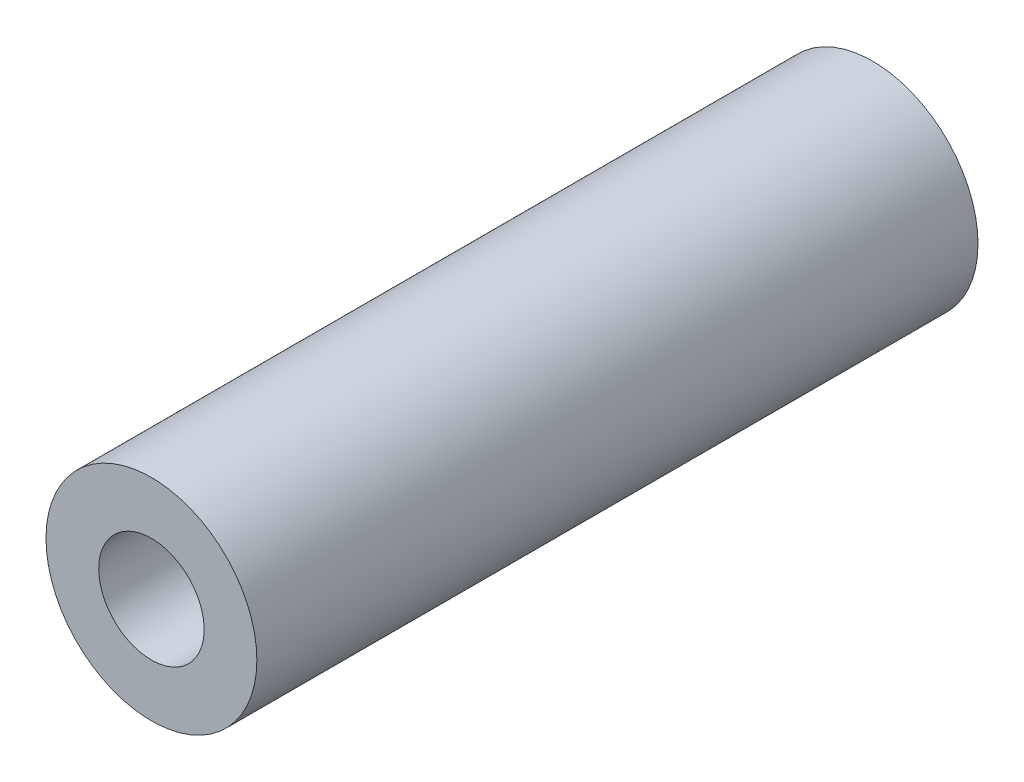
ISO-10303-21;
HEADER;
FILE_DESCRIPTION(('STEP AP214'),'2;1');
FILE_NAME('part.step','',(''),(''),'','','');
FILE_SCHEMA(('AUTOMOTIVE_DESIGN { 1 0 10303 214 1 1 1 1 }'));
ENDSEC;
DATA;
#1=APPLICATION_CONTEXT('core data for automotive mechanical design processes');
#2=APPLICATION_PROTOCOL_DEFINITION('international standard','automotive_design',2000,#1);
#3=PRODUCT_CONTEXT('',#1,'mechanical');
#4=PRODUCT('Part','Part','',(#3));
#5=PRODUCT_RELATED_PRODUCT_CATEGORY('part','',(#4));
#6=PRODUCT_DEFINITION_FORMATION('','',#4);
#7=PRODUCT_DEFINITION_CONTEXT('part definition',#1,'design');
#8=PRODUCT_DEFINITION('design','',#6,#7);
#9=PRODUCT_DEFINITION_SHAPE('','',#8);
#10=(LENGTH_UNIT() NAMED_UNIT(*) SI_UNIT(.MILLI.,.METRE.));
#11=(NAMED_UNIT(*) PLANE_ANGLE_UNIT() SI_UNIT($,.RADIAN.));
#12=(NAMED_UNIT(*) SI_UNIT($,.STERADIAN.) SOLID_ANGLE_UNIT());
#13=UNCERTAINTY_MEASURE_WITH_UNIT(LENGTH_MEASURE(1.E-05),#10,'distance_accuracy_value','');
#14=(GEOMETRIC_REPRESENTATION_CONTEXT(3) GLOBAL_UNCERTAINTY_ASSIGNED_CONTEXT((#13)) GLOBAL_UNIT_ASSIGNED_CONTEXT((#10,
#11,#12)) REPRESENTATION_CONTEXT('',''));
#15=CARTESIAN_POINT('',(0.,0.,0.));
#16=DIRECTION('',(0.,0.,1.));
#17=DIRECTION('',(1.,0.,0.));
#18=AXIS2_PLACEMENT_3D('',#15,#16,#17);
#19=CARTESIAN_POINT('',(0.,0.,43.434));
#20=DIRECTION('',(0.,0.,1.));
#21=DIRECTION('',(1.,0.,0.));
#22=AXIS2_PLACEMENT_3D('',#19,#20,#21);
#23=PLANE('',#22);
#24=CARTESIAN_POINT('',(0.,0.,43.434));
#25=DIRECTION('',(0.,0.,1.));
#26=DIRECTION('',(1.,0.,0.));
#27=AXIS2_PLACEMENT_3D('',#24,#25,#26);
#28=CIRCLE('',#27,6.35);
#29=CARTESIAN_POINT('',(-6.35,0.,43.434));
#30=VERTEX_POINT('',#29);
#31=EDGE_CURVE('E10',#30,#30,#28,.T.);
#32=ORIENTED_EDGE('',*,*,#31,.T.);
#33=EDGE_LOOP('',(#32));
#34=FACE_BOUND('',#33,.T.);
#35=CARTESIAN_POINT('',(0.,0.,43.434));
#36=DIRECTION('',(0.,0.,1.));
#37=DIRECTION('',(1.,0.,0.));
#38=AXIS2_PLACEMENT_3D('',#35,#36,#37);
#39=CIRCLE('',#38,3.175);
#40=CARTESIAN_POINT('',(-3.175,0.,43.434));
#41=VERTEX_POINT('',#40);
#42=EDGE_CURVE('E43',#41,#41,#39,.T.);
#43=ORIENTED_EDGE('',*,*,#42,.F.);
#44=EDGE_LOOP('',(#43));
#45=FACE_BOUND('',#44,.T.);
#46=ADVANCED_FACE('F32',(#34,#45),#23,.T.);
#47=CARTESIAN_POINT('',(0.,0.,0.));
#48=DIRECTION('',(0.,0.,1.));
#49=DIRECTION('',(1.,0.,0.));
#50=AXIS2_PLACEMENT_3D('',#47,#48,#49);
#51=PLANE('',#50);
#52=CARTESIAN_POINT('',(0.,0.,0.));
#53=DIRECTION('',(0.,0.,1.));
#54=DIRECTION('',(1.,0.,0.));
#55=AXIS2_PLACEMENT_3D('',#52,#53,#54);
#56=CIRCLE('',#55,6.35);
#57=CARTESIAN_POINT('',(-6.35,0.,0.));
#58=VERTEX_POINT('',#57);
#59=EDGE_CURVE('E36',#58,#58,#56,.T.);
#60=ORIENTED_EDGE('',*,*,#59,.F.);
#61=EDGE_LOOP('',(#60));
#62=FACE_BOUND('',#61,.T.);
#63=CARTESIAN_POINT('',(0.,0.,0.));
#64=DIRECTION('',(0.,0.,1.));
#65=DIRECTION('',(1.,0.,0.));
#66=AXIS2_PLACEMENT_3D('',#63,#64,#65);
#67=CIRCLE('',#66,3.175);
#68=CARTESIAN_POINT('',(-3.175,0.,0.));
#69=VERTEX_POINT('',#68);
#70=EDGE_CURVE('E45',#69,#69,#67,.T.);
#71=ORIENTED_EDGE('',*,*,#70,.T.);
#72=EDGE_LOOP('',(#71));
#73=FACE_BOUND('',#72,.T.);
#74=ADVANCED_FACE('F55',(#62,#73),#51,.F.);
#75=CARTESIAN_POINT('',(0.,0.,43.434));
#76=DIRECTION('',(0.,0.,-1.));
#77=DIRECTION('',(-1.,0.,0.));
#78=AXIS2_PLACEMENT_3D('',#75,#76,#77);
#79=CYLINDRICAL_SURFACE('',#78,6.35);
#80=CARTESIAN_POINT('',(-6.35,0.,43.434));
#81=CARTESIAN_POINT('',(-6.35,0.,42.9815625));
#82=CARTESIAN_POINT('',(-6.35,0.,42.529125));
#83=CARTESIAN_POINT('',(-6.35,0.,41.62425));
#84=CARTESIAN_POINT('',(-6.35,0.,41.1718125));
#85=CARTESIAN_POINT('',(-6.35,0.,40.2669375));
#86=CARTESIAN_POINT('',(-6.35,0.,39.8145));
#87=CARTESIAN_POINT('',(-6.35,0.,38.909625));
#88=CARTESIAN_POINT('',(-6.35,0.,38.4571875));
#89=CARTESIAN_POINT('',(-6.35,0.,37.5523125));
#90=CARTESIAN_POINT('',(-6.35,0.,37.099875));
#91=CARTESIAN_POINT('',(-6.35,0.,36.195));
#92=CARTESIAN_POINT('',(-6.35,0.,35.7425625));
#93=CARTESIAN_POINT('',(-6.35,0.,34.8376875));
#94=CARTESIAN_POINT('',(-6.35,0.,34.38525));
#95=CARTESIAN_POINT('',(-6.35,0.,33.480375));
#96=CARTESIAN_POINT('',(-6.35,0.,33.0279375));
#97=CARTESIAN_POINT('',(-6.35,0.,32.1230625));
#98=CARTESIAN_POINT('',(-6.35,0.,31.670625));
#99=CARTESIAN_POINT('',(-6.35,0.,30.76575));
#100=CARTESIAN_POINT('',(-6.35,0.,30.3133125));
#101=CARTESIAN_POINT('',(-6.35,0.,29.4084375));
#102=CARTESIAN_POINT('',(-6.35,0.,28.956));
#103=CARTESIAN_POINT('',(-6.35,0.,28.051125));
#104=CARTESIAN_POINT('',(-6.35,0.,27.5986875));
#105=CARTESIAN_POINT('',(-6.35,0.,26.6938125));
#106=CARTESIAN_POINT('',(-6.35,0.,26.241375));
#107=CARTESIAN_POINT('',(-6.35,0.,25.3365));
#108=CARTESIAN_POINT('',(-6.35,0.,24.8840625));
#109=CARTESIAN_POINT('',(-6.35,0.,23.9791875));
#110=CARTESIAN_POINT('',(-6.35,0.,23.52675));
#111=CARTESIAN_POINT('',(-6.35,0.,22.621875));
#112=CARTESIAN_POINT('',(-6.35,0.,22.1694375));
#113=CARTESIAN_POINT('',(-6.35,0.,21.2645625));
#114=CARTESIAN_POINT('',(-6.35,0.,20.812125));
#115=CARTESIAN_POINT('',(-6.35,0.,19.90725));
#116=CARTESIAN_POINT('',(-6.35,0.,19.4548125));
#117=CARTESIAN_POINT('',(-6.35,0.,18.5499375));
#118=CARTESIAN_POINT('',(-6.35,0.,18.0975));
#119=CARTESIAN_POINT('',(-6.35,0.,17.192625));
#120=CARTESIAN_POINT('',(-6.35,0.,16.7401875));
#121=CARTESIAN_POINT('',(-6.35,0.,15.8353125));
#122=CARTESIAN_POINT('',(-6.35,0.,15.382875));
#123=CARTESIAN_POINT('',(-6.35,0.,14.478));
#124=CARTESIAN_POINT('',(-6.35,0.,14.0255625));
#125=CARTESIAN_POINT('',(-6.35,0.,13.1206875));
#126=CARTESIAN_POINT('',(-6.35,0.,12.66825));
#127=CARTESIAN_POINT('',(-6.35,0.,11.763375));
#128=CARTESIAN_POINT('',(-6.35,0.,11.3109375));
#129=CARTESIAN_POINT('',(-6.35,0.,10.4060625));
#130=CARTESIAN_POINT('',(-6.35,0.,9.953625));
#131=CARTESIAN_POINT('',(-6.35,0.,9.04874999999999));
#132=CARTESIAN_POINT('',(-6.35,0.,8.59631249999999));
#133=CARTESIAN_POINT('',(-6.35,0.,7.69143749999999));
#134=CARTESIAN_POINT('',(-6.35,0.,7.239));
#135=CARTESIAN_POINT('',(-6.35,0.,6.334125));
#136=CARTESIAN_POINT('',(-6.35,0.,5.8816875));
#137=CARTESIAN_POINT('',(-6.35,0.,4.9768125));
#138=CARTESIAN_POINT('',(-6.35,0.,4.524375));
#139=CARTESIAN_POINT('',(-6.35,0.,3.6195));
#140=CARTESIAN_POINT('',(-6.35,0.,3.16706249999999));
#141=CARTESIAN_POINT('',(-6.35,0.,2.26218749999999));
#142=CARTESIAN_POINT('',(-6.35,0.,1.80974999999999));
#143=CARTESIAN_POINT('',(-6.35,0.,0.904874999999993));
#144=CARTESIAN_POINT('',(-6.35,0.,0.452437499999993));
#145=CARTESIAN_POINT('',(-6.35,0.,0.));
#146=B_SPLINE_CURVE_WITH_KNOTS('',3,(#80,#81,#82,#83,#84,#85,#86,#87,#88,#89,#90,#91,#92,#93,
#94,#95,#96,#97,#98,#99,#100,#101,#102,#103,#104,#105,#106,#107,#108,#109,#110,#111,#112,#113,
#114,#115,#116,#117,#118,#119,#120,#121,#122,#123,#124,#125,#126,#127,#128,#129,#130,#131,#132,
#133,#134,#135,#136,#137,#138,#139,#140,#141,#142,#143,#144,#145),.UNSPECIFIED.,.F.,.F.,(4,2,2,
2,2,2,2,2,2,2,2,2,2,2,2,2,2,2,2,2,2,2,2,2,2,2,2,2,2,2,2,2,4),(0.,1.35731250000001,
2.71462500000001,4.0719375,5.42925,6.7865625,8.143875,9.50118750000001,10.8585,12.2158125,
13.573125,14.9304375,16.28775,17.6450625,19.002375,20.3596875,21.717,23.0743125,24.431625,
25.7889375,27.14625,28.5035625,29.860875,31.2181875,32.5755,33.9328125,35.290125,36.6474375,
38.00475,39.3620625,40.719375,42.0766875,43.434),.UNSPECIFIED.);
#147=EDGE_CURVE('BSEAM34',#30,#58,#146,.T.);
#148=ORIENTED_EDGE('',*,*,#31,.F.);
#149=ORIENTED_EDGE('',*,*,#59,.T.);
#150=ORIENTED_EDGE('',*,*,#147,.T.);
#151=ORIENTED_EDGE('',*,*,#147,.F.);
#152=EDGE_LOOP('',(#148,#150,#149,#151));
#153=FACE_BOUND('',#152,.T.);
#154=ADVANCED_FACE('F34',(#153),#79,.T.);
#155=CARTESIAN_POINT('',(0.,0.,43.434));
#156=DIRECTION('',(0.,0.,-1.));
#157=DIRECTION('',(-1.,0.,0.));
#158=AXIS2_PLACEMENT_3D('',#155,#156,#157);
#159=CYLINDRICAL_SURFACE('',#158,3.175);
#160=CARTESIAN_POINT('',(-3.175,0.,43.434));
#161=CARTESIAN_POINT('',(-3.175,0.,42.9815625));
#162=CARTESIAN_POINT('',(-3.175,0.,42.529125));
#163=CARTESIAN_POINT('',(-3.175,0.,41.62425));
#164=CARTESIAN_POINT('',(-3.175,0.,41.1718125));
#165=CARTESIAN_POINT('',(-3.175,0.,40.2669375));
#166=CARTESIAN_POINT('',(-3.175,0.,39.8145));
#167=CARTESIAN_POINT('',(-3.175,0.,38.909625));
#168=CARTESIAN_POINT('',(-3.175,0.,38.4571875));
#169=CARTESIAN_POINT('',(-3.175,0.,37.5523125));
#170=CARTESIAN_POINT('',(-3.175,0.,37.099875));
#171=CARTESIAN_POINT('',(-3.175,0.,36.195));
#172=CARTESIAN_POINT('',(-3.175,0.,35.7425625));
#173=CARTESIAN_POINT('',(-3.175,0.,34.8376875));
#174=CARTESIAN_POINT('',(-3.175,0.,34.38525));
#175=CARTESIAN_POINT('',(-3.175,0.,33.480375));
#176=CARTESIAN_POINT('',(-3.175,0.,33.0279375));
#177=CARTESIAN_POINT('',(-3.175,0.,32.1230625));
#178=CARTESIAN_POINT('',(-3.175,0.,31.670625));
#179=CARTESIAN_POINT('',(-3.175,0.,30.76575));
#180=CARTESIAN_POINT('',(-3.175,0.,30.3133125));
#181=CARTESIAN_POINT('',(-3.175,0.,29.4084375));
#182=CARTESIAN_POINT('',(-3.175,0.,28.956));
#183=CARTESIAN_POINT('',(-3.175,0.,28.051125));
#184=CARTESIAN_POINT('',(-3.175,0.,27.5986875));
#185=CARTESIAN_POINT('',(-3.175,0.,26.6938125));
#186=CARTESIAN_POINT('',(-3.175,0.,26.241375));
#187=CARTESIAN_POINT('',(-3.175,0.,25.3365));
#188=CARTESIAN_POINT('',(-3.175,0.,24.8840625));
#189=CARTESIAN_POINT('',(-3.175,0.,23.9791875));
#190=CARTESIAN_POINT('',(-3.175,0.,23.52675));
#191=CARTESIAN_POINT('',(-3.175,0.,22.621875));
#192=CARTESIAN_POINT('',(-3.175,0.,22.1694375));
#193=CARTESIAN_POINT('',(-3.175,0.,21.2645625));
#194=CARTESIAN_POINT('',(-3.175,0.,20.812125));
#195=CARTESIAN_POINT('',(-3.175,0.,19.90725));
#196=CARTESIAN_POINT('',(-3.175,0.,19.4548125));
#197=CARTESIAN_POINT('',(-3.175,0.,18.5499375));
#198=CARTESIAN_POINT('',(-3.175,0.,18.0975));
#199=CARTESIAN_POINT('',(-3.175,0.,17.192625));
#200=CARTESIAN_POINT('',(-3.175,0.,16.7401875));
#201=CARTESIAN_POINT('',(-3.175,0.,15.8353125));
#202=CARTESIAN_POINT('',(-3.175,0.,15.382875));
#203=CARTESIAN_POINT('',(-3.175,0.,14.478));
#204=CARTESIAN_POINT('',(-3.175,0.,14.0255625));
#205=CARTESIAN_POINT('',(-3.175,0.,13.1206875));
#206=CARTESIAN_POINT('',(-3.175,0.,12.66825));
#207=CARTESIAN_POINT('',(-3.175,0.,11.763375));
#208=CARTESIAN_POINT('',(-3.175,0.,11.3109375));
#209=CARTESIAN_POINT('',(-3.175,0.,10.4060625));
#210=CARTESIAN_POINT('',(-3.175,0.,9.953625));
#211=CARTESIAN_POINT('',(-3.175,0.,9.04874999999999));
#212=CARTESIAN_POINT('',(-3.175,0.,8.59631249999999));
#213=CARTESIAN_POINT('',(-3.175,0.,7.69143749999999));
#214=CARTESIAN_POINT('',(-3.175,0.,7.239));
#215=CARTESIAN_POINT('',(-3.175,0.,6.334125));
#216=CARTESIAN_POINT('',(-3.175,0.,5.8816875));
#217=CARTESIAN_POINT('',(-3.175,0.,4.9768125));
#218=CARTESIAN_POINT('',(-3.175,0.,4.524375));
#219=CARTESIAN_POINT('',(-3.175,0.,3.6195));
#220=CARTESIAN_POINT('',(-3.175,0.,3.16706249999999));
#221=CARTESIAN_POINT('',(-3.175,0.,2.26218749999999));
#222=CARTESIAN_POINT('',(-3.175,0.,1.80974999999999));
#223=CARTESIAN_POINT('',(-3.175,0.,0.904874999999993));
#224=CARTESIAN_POINT('',(-3.175,0.,0.452437499999993));
#225=CARTESIAN_POINT('',(-3.175,0.,0.));
#226=B_SPLINE_CURVE_WITH_KNOTS('',3,(#160,#161,#162,#163,#164,#165,#166,#167,#168,#169,#170,
#171,#172,#173,#174,#175,#176,#177,#178,#179,#180,#181,#182,#183,#184,#185,#186,#187,#188,#189,
#190,#191,#192,#193,#194,#195,#196,#197,#198,#199,#200,#201,#202,#203,#204,#205,#206,#207,#208,
#209,#210,#211,#212,#213,#214,#215,#216,#217,#218,#219,#220,#221,#222,#223,#224,#225),
.UNSPECIFIED.,.F.,.F.,(4,2,2,2,2,2,2,2,2,2,2,2,2,2,2,2,2,2,2,2,2,2,2,2,2,2,2,2,2,2,2,2,4),(0.,
1.35731250000001,2.71462500000001,4.0719375,5.42925,6.7865625,8.143875,9.50118750000001,10.8585,
12.2158125,13.573125,14.9304375,16.28775,17.6450625,19.002375,20.3596875,21.717,23.0743125,
24.431625,25.7889375,27.14625,28.5035625,29.860875,31.2181875,32.5755,33.9328125,35.290125,
36.6474375,38.00475,39.3620625,40.719375,42.0766875,43.434),.UNSPECIFIED.);
#227=EDGE_CURVE('BSEAM51',#41,#69,#226,.T.);
#228=ORIENTED_EDGE('',*,*,#42,.T.);
#229=ORIENTED_EDGE('',*,*,#70,.F.);
#230=ORIENTED_EDGE('',*,*,#227,.T.);
#231=ORIENTED_EDGE('',*,*,#227,.F.);
#232=EDGE_LOOP('',(#228,#230,#229,#231));
#233=FACE_BOUND('',#232,.T.);
#234=ADVANCED_FACE('F51',(#233),#159,.F.);
#235=CLOSED_SHELL('',(#46,#74,#154,#234));
#236=MANIFOLD_SOLID_BREP('B2',#235);
#237=ADVANCED_BREP_SHAPE_REPRESENTATION('',(#18,#236),#14);
#238=SHAPE_DEFINITION_REPRESENTATION(#9,#237);
ENDSEC;
END-ISO-10303-21;
